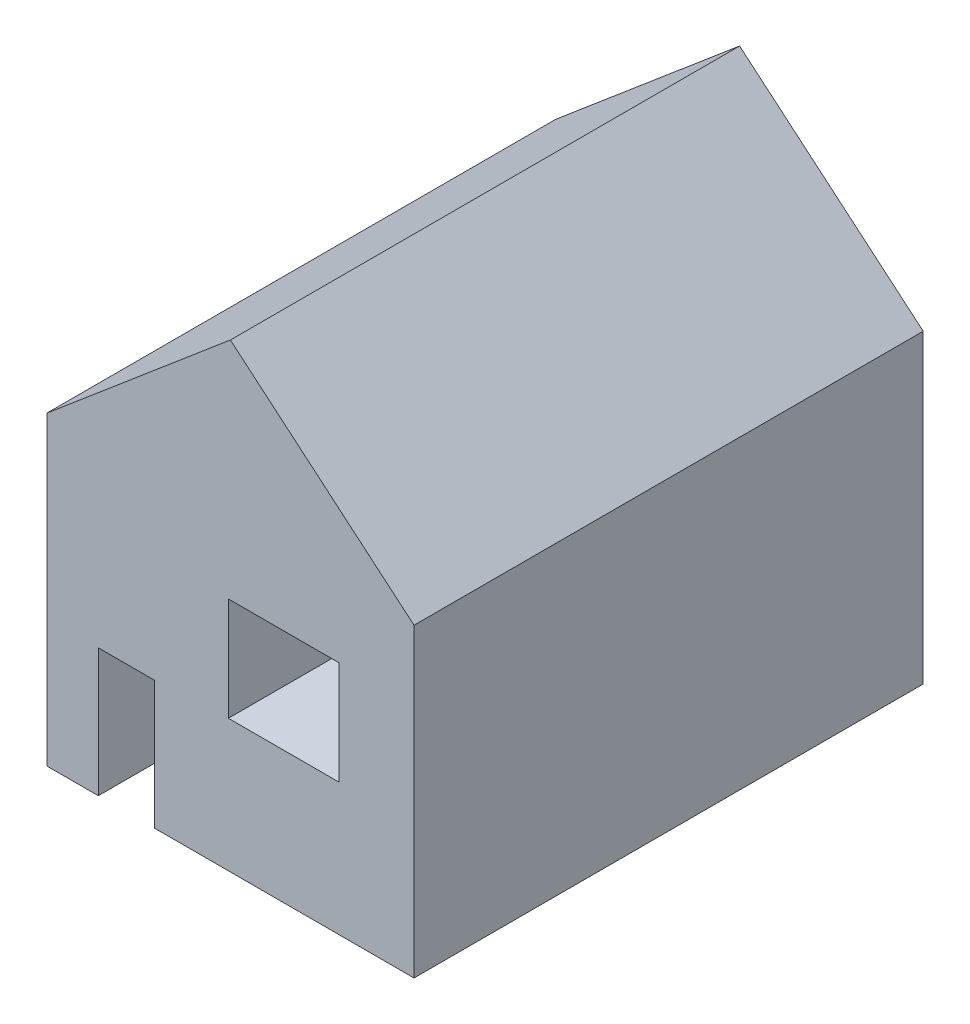
ISO-10303-21;
HEADER;
FILE_DESCRIPTION(('STEP AP214'),'2;1');
FILE_NAME('part.step','',(''),(''),'','','');
FILE_SCHEMA(('AUTOMOTIVE_DESIGN { 1 0 10303 214 1 1 1 1 }'));
ENDSEC;
DATA;
#1=APPLICATION_CONTEXT('core data for automotive mechanical design processes');
#2=APPLICATION_PROTOCOL_DEFINITION('international standard','automotive_design',2000,#1);
#3=PRODUCT_CONTEXT('',#1,'mechanical');
#4=PRODUCT('Part','Part','',(#3));
#5=PRODUCT_RELATED_PRODUCT_CATEGORY('part','',(#4));
#6=PRODUCT_DEFINITION_FORMATION('','',#4);
#7=PRODUCT_DEFINITION_CONTEXT('part definition',#1,'design');
#8=PRODUCT_DEFINITION('design','',#6,#7);
#9=PRODUCT_DEFINITION_SHAPE('','',#8);
#10=(LENGTH_UNIT() NAMED_UNIT(*) SI_UNIT(.MILLI.,.METRE.));
#11=(NAMED_UNIT(*) PLANE_ANGLE_UNIT() SI_UNIT($,.RADIAN.));
#12=(NAMED_UNIT(*) SI_UNIT($,.STERADIAN.) SOLID_ANGLE_UNIT());
#13=UNCERTAINTY_MEASURE_WITH_UNIT(LENGTH_MEASURE(1.E-05),#10,'distance_accuracy_value','');
#14=(GEOMETRIC_REPRESENTATION_CONTEXT(3) GLOBAL_UNCERTAINTY_ASSIGNED_CONTEXT((#13)) GLOBAL_UNIT_ASSIGNED_CONTEXT((#10,
#11,#12)) REPRESENTATION_CONTEXT('',''));
#15=CARTESIAN_POINT('',(0.,0.,0.));
#16=DIRECTION('',(0.,0.,1.));
#17=DIRECTION('',(1.,0.,0.));
#18=AXIS2_PLACEMENT_3D('',#15,#16,#17);
#19=CARTESIAN_POINT('',(0.,-3.62960003633556,-80.));
#20=DIRECTION('',(0.,-1.,0.));
#21=DIRECTION('',(0.,0.,-1.));
#22=AXIS2_PLACEMENT_3D('',#19,#20,#21);
#23=PLANE('',#22);
#24=DIRECTION('',(1.,0.,0.));
#25=VECTOR('',#24,1.);
#26=CARTESIAN_POINT('',(0.,-3.62960003633556,0.));
#27=LINE('',#26,#25);
#28=CARTESIAN_POINT('',(-74.7897581738786,-3.62960003633556,0.));
#29=VERTEX_POINT('',#28);
#30=CARTESIAN_POINT('',(-65.9867486639112,-3.62960003633556,0.));
#31=VERTEX_POINT('',#30);
#32=EDGE_CURVE('E169',#29,#31,#27,.T.);
#33=ORIENTED_EDGE('',*,*,#32,.F.);
#34=DIRECTION('',(0.,0.,1.));
#35=VECTOR('',#34,1.);
#36=CARTESIAN_POINT('',(-74.7897581738786,-3.62960003633556,-80.));
#37=LINE('',#36,#35);
#38=CARTESIAN_POINT('',(-74.7897581738786,-3.62960003633556,-80.));
#39=VERTEX_POINT('',#38);
#40=EDGE_CURVE('E11',#39,#29,#37,.T.);
#41=ORIENTED_EDGE('',*,*,#40,.F.);
#42=DIRECTION('',(1.,0.,0.));
#43=VECTOR('',#42,1.);
#44=CARTESIAN_POINT('',(0.,-3.62960003633556,-80.));
#45=LINE('',#44,#43);
#46=CARTESIAN_POINT('',(-65.9867486639112,-3.62960003633556,-80.));
#47=VERTEX_POINT('',#46);
#48=EDGE_CURVE('E222',#39,#47,#45,.T.);
#49=ORIENTED_EDGE('',*,*,#48,.T.);
#50=DIRECTION('',(0.,0.,1.));
#51=VECTOR('',#50,1.);
#52=CARTESIAN_POINT('',(-65.9867486639112,-3.62960003633556,-80.));
#53=LINE('',#52,#51);
#54=EDGE_CURVE('E196',#47,#31,#53,.T.);
#55=ORIENTED_EDGE('',*,*,#54,.T.);
#56=EDGE_LOOP('',(#33,#41,#49,#55));
#57=FACE_BOUND('',#56,.T.);
#58=ADVANCED_FACE('F35',(#57),#23,.T.);
#59=CARTESIAN_POINT('',(-74.7897581738786,0.,-80.));
#60=DIRECTION('',(1.,0.,0.));
#61=DIRECTION('',(0.,0.,-1.));
#62=AXIS2_PLACEMENT_3D('',#59,#60,#61);
#63=PLANE('',#62);
#64=DIRECTION('',(0.,1.,0.));
#65=VECTOR('',#64,1.);
#66=CARTESIAN_POINT('',(-74.7897581738786,0.,0.));
#67=LINE('',#66,#65);
#68=CARTESIAN_POINT('',(-74.7897581738786,-23.7561001419538,0.));
#69=VERTEX_POINT('',#68);
#70=EDGE_CURVE('E183',#69,#29,#67,.T.);
#71=ORIENTED_EDGE('',*,*,#70,.F.);
#72=DIRECTION('',(0.,0.,1.));
#73=VECTOR('',#72,1.);
#74=CARTESIAN_POINT('',(-74.7897581738786,-23.7561001419538,-80.));
#75=LINE('',#74,#73);
#76=CARTESIAN_POINT('',(-74.7897581738786,-23.7561001419538,-80.));
#77=VERTEX_POINT('',#76);
#78=EDGE_CURVE('E45',#77,#69,#75,.T.);
#79=ORIENTED_EDGE('',*,*,#78,.F.);
#80=DIRECTION('',(0.,1.,0.));
#81=VECTOR('',#80,1.);
#82=CARTESIAN_POINT('',(-74.7897581738786,0.,-80.));
#83=LINE('',#82,#81);
#84=EDGE_CURVE('E149',#77,#39,#83,.T.);
#85=ORIENTED_EDGE('',*,*,#84,.T.);
#86=ORIENTED_EDGE('',*,*,#40,.T.);
#87=EDGE_LOOP('',(#71,#79,#85,#86));
#88=FACE_BOUND('',#87,.T.);
#89=ADVANCED_FACE('F245',(#88),#63,.T.);
#90=CARTESIAN_POINT('',(0.,-23.7561001419538,-80.));
#91=DIRECTION('',(0.,-1.,0.));
#92=DIRECTION('',(0.,0.,-1.));
#93=AXIS2_PLACEMENT_3D('',#90,#91,#92);
#94=PLANE('',#93);
#95=DIRECTION('',(1.,0.,0.));
#96=VECTOR('',#95,1.);
#97=CARTESIAN_POINT('',(0.,-23.7561001419538,0.));
#98=LINE('',#97,#96);
#99=CARTESIAN_POINT('',(-82.8897581738786,-23.7561001419538,0.));
#100=VERTEX_POINT('',#99);
#101=EDGE_CURVE('E136',#100,#69,#98,.T.);
#102=ORIENTED_EDGE('',*,*,#101,.F.);
#103=DIRECTION('',(0.,0.,1.));
#104=VECTOR('',#103,1.);
#105=CARTESIAN_POINT('',(-82.8897581738786,-23.7561001419538,-80.));
#106=LINE('',#105,#104);
#107=CARTESIAN_POINT('',(-82.8897581738786,-23.7561001419538,-80.));
#108=VERTEX_POINT('',#107);
#109=EDGE_CURVE('E131',#108,#100,#106,.T.);
#110=ORIENTED_EDGE('',*,*,#109,.F.);
#111=DIRECTION('',(1.,0.,0.));
#112=VECTOR('',#111,1.);
#113=CARTESIAN_POINT('',(0.,-23.7561001419538,-80.));
#114=LINE('',#113,#112);
#115=EDGE_CURVE('E134',#108,#77,#114,.T.);
#116=ORIENTED_EDGE('',*,*,#115,.T.);
#117=ORIENTED_EDGE('',*,*,#78,.T.);
#118=EDGE_LOOP('',(#102,#110,#116,#117));
#119=FACE_BOUND('',#118,.T.);
#120=ADVANCED_FACE('F133',(#119),#94,.T.);
#121=CARTESIAN_POINT('',(-82.8897581738786,0.,-80.));
#122=DIRECTION('',(-1.,0.,0.));
#123=DIRECTION('',(0.,0.,1.));
#124=AXIS2_PLACEMENT_3D('',#121,#122,#123);
#125=PLANE('',#124);
#126=DIRECTION('',(0.,-1.,0.));
#127=VECTOR('',#126,1.);
#128=CARTESIAN_POINT('',(-82.8897581738786,0.,0.));
#129=LINE('',#128,#127);
#130=CARTESIAN_POINT('',(-82.8897581738786,24.2438998580462,0.));
#131=VERTEX_POINT('',#130);
#132=EDGE_CURVE('E181',#131,#100,#129,.T.);
#133=ORIENTED_EDGE('',*,*,#132,.F.);
#134=DIRECTION('',(0.,0.,1.));
#135=VECTOR('',#134,1.);
#136=CARTESIAN_POINT('',(-82.8897581738786,24.2438998580462,-80.));
#137=LINE('',#136,#135);
#138=CARTESIAN_POINT('',(-82.8897581738786,24.2438998580462,-80.));
#139=VERTEX_POINT('',#138);
#140=EDGE_CURVE('E141',#139,#131,#137,.T.);
#141=ORIENTED_EDGE('',*,*,#140,.F.);
#142=DIRECTION('',(0.,-1.,0.));
#143=VECTOR('',#142,1.);
#144=CARTESIAN_POINT('',(-82.8897581738786,0.,-80.));
#145=LINE('',#144,#143);
#146=EDGE_CURVE('E147',#139,#108,#145,.T.);
#147=ORIENTED_EDGE('',*,*,#146,.T.);
#148=ORIENTED_EDGE('',*,*,#109,.T.);
#149=EDGE_LOOP('',(#133,#141,#147,#148));
#150=FACE_BOUND('',#149,.T.);
#151=ADVANCED_FACE('F152',(#150),#125,.T.);
#152=CARTESIAN_POINT('',(-25.1919853273553,0.,-80.));
#153=DIRECTION('',(-1.,0.,0.));
#154=DIRECTION('',(0.,-1.,0.));
#155=AXIS2_PLACEMENT_3D('',#152,#153,#154);
#156=PLANE('',#155);
#157=DIRECTION('',(0.,-1.,0.));
#158=VECTOR('',#157,1.);
#159=CARTESIAN_POINT('',(-25.1919853273553,0.,0.));
#160=LINE('',#159,#158);
#161=CARTESIAN_POINT('',(-25.1919853273553,24.2438998580462,0.));
#162=VERTEX_POINT('',#161);
#163=CARTESIAN_POINT('',(-25.1919853273552,-23.7561001419538,0.));
#164=VERTEX_POINT('',#163);
#165=EDGE_CURVE('E178',#162,#164,#160,.T.);
#166=ORIENTED_EDGE('',*,*,#165,.T.);
#167=DIRECTION('',(0.,0.,1.));
#168=VECTOR('',#167,1.);
#169=CARTESIAN_POINT('',(-25.1919853273552,-23.7561001419538,-80.));
#170=LINE('',#169,#168);
#171=CARTESIAN_POINT('',(-25.1919853273552,-23.7561001419538,-80.));
#172=VERTEX_POINT('',#171);
#173=EDGE_CURVE('E192',#172,#164,#170,.T.);
#174=ORIENTED_EDGE('',*,*,#173,.F.);
#175=DIRECTION('',(0.,-1.,0.));
#176=VECTOR('',#175,1.);
#177=CARTESIAN_POINT('',(-25.1919853273553,0.,-80.));
#178=LINE('',#177,#176);
#179=CARTESIAN_POINT('',(-25.1919853273553,24.2438998580462,-80.));
#180=VERTEX_POINT('',#179);
#181=EDGE_CURVE('E154',#180,#172,#178,.T.);
#182=ORIENTED_EDGE('',*,*,#181,.F.);
#183=DIRECTION('',(0.,0.,1.));
#184=VECTOR('',#183,1.);
#185=CARTESIAN_POINT('',(-25.1919853273553,24.2438998580462,-80.));
#186=LINE('',#185,#184);
#187=EDGE_CURVE('E189',#180,#162,#186,.T.);
#188=ORIENTED_EDGE('',*,*,#187,.T.);
#189=EDGE_LOOP('',(#166,#174,#182,#188));
#190=FACE_BOUND('',#189,.T.);
#191=ADVANCED_FACE('F268',(#190),#156,.F.);
#192=CARTESIAN_POINT('',(-65.9867486639112,-23.7561001419538,0.));
#193=VERTEX_POINT('',#192);
#194=EDGE_CURVE('E175',#193,#164,#98,.T.);
#195=ORIENTED_EDGE('',*,*,#194,.F.);
#196=DIRECTION('',(0.,0.,1.));
#197=VECTOR('',#196,1.);
#198=CARTESIAN_POINT('',(-65.9867486639112,-23.7561001419538,-80.));
#199=LINE('',#198,#197);
#200=CARTESIAN_POINT('',(-65.9867486639112,-23.7561001419538,-80.));
#201=VERTEX_POINT('',#200);
#202=EDGE_CURVE('E194',#201,#193,#199,.T.);
#203=ORIENTED_EDGE('',*,*,#202,.F.);
#204=EDGE_CURVE('E151',#201,#172,#114,.T.);
#205=ORIENTED_EDGE('',*,*,#204,.T.);
#206=ORIENTED_EDGE('',*,*,#173,.T.);
#207=EDGE_LOOP('',(#195,#203,#205,#206));
#208=FACE_BOUND('',#207,.T.);
#209=ADVANCED_FACE('F238',(#208),#94,.T.);
#210=CARTESIAN_POINT('',(0.,-3.,-80.));
#211=DIRECTION('',(0.,-1.,0.));
#212=DIRECTION('',(0.,0.,-1.));
#213=AXIS2_PLACEMENT_3D('',#210,#211,#212);
#214=PLANE('',#213);
#215=DIRECTION('',(1.,0.,0.));
#216=VECTOR('',#215,1.);
#217=CARTESIAN_POINT('',(0.,-3.,0.));
#218=LINE('',#217,#216);
#219=CARTESIAN_POINT('',(-54.3591442802856,-3.,0.));
#220=VERTEX_POINT('',#219);
#221=CARTESIAN_POINT('',(-36.9821186485768,-3.,0.));
#222=VERTEX_POINT('',#221);
#223=EDGE_CURVE('E159',#220,#222,#218,.T.);
#224=ORIENTED_EDGE('',*,*,#223,.T.);
#225=DIRECTION('',(0.,0.,1.));
#226=VECTOR('',#225,1.);
#227=CARTESIAN_POINT('',(-36.9821186485768,-3.,-80.));
#228=LINE('',#227,#226);
#229=CARTESIAN_POINT('',(-36.9821186485768,-3.,-80.));
#230=VERTEX_POINT('',#229);
#231=EDGE_CURVE('E198',#230,#222,#228,.T.);
#232=ORIENTED_EDGE('',*,*,#231,.F.);
#233=DIRECTION('',(1.,0.,0.));
#234=VECTOR('',#233,1.);
#235=CARTESIAN_POINT('',(0.,-3.,-80.));
#236=LINE('',#235,#234);
#237=CARTESIAN_POINT('',(-54.3591442802856,-3.,-80.));
#238=VERTEX_POINT('',#237);
#239=EDGE_CURVE('E185',#238,#230,#236,.T.);
#240=ORIENTED_EDGE('',*,*,#239,.F.);
#241=DIRECTION('',(0.,0.,1.));
#242=VECTOR('',#241,1.);
#243=CARTESIAN_POINT('',(-54.3591442802856,-3.,-80.));
#244=LINE('',#243,#242);
#245=EDGE_CURVE('E39',#238,#220,#244,.T.);
#246=ORIENTED_EDGE('',*,*,#245,.T.);
#247=EDGE_LOOP('',(#224,#232,#240,#246));
#248=FACE_BOUND('',#247,.T.);
#249=ADVANCED_FACE('F37',(#248),#214,.F.);
#250=CARTESIAN_POINT('',(-36.9821186485768,0.,-80.));
#251=DIRECTION('',(1.,0.,0.));
#252=DIRECTION('',(0.,0.,-1.));
#253=AXIS2_PLACEMENT_3D('',#250,#251,#252);
#254=PLANE('',#253);
#255=DIRECTION('',(0.,1.,0.));
#256=VECTOR('',#255,1.);
#257=CARTESIAN_POINT('',(-36.9821186485768,0.,0.));
#258=LINE('',#257,#256);
#259=CARTESIAN_POINT('',(-36.9821186485768,13.2393230685379,0.));
#260=VERTEX_POINT('',#259);
#261=EDGE_CURVE('E167',#222,#260,#258,.T.);
#262=ORIENTED_EDGE('',*,*,#261,.T.);
#263=DIRECTION('',(0.,0.,1.));
#264=VECTOR('',#263,1.);
#265=CARTESIAN_POINT('',(-36.9821186485768,13.2393230685379,-80.));
#266=LINE('',#265,#264);
#267=CARTESIAN_POINT('',(-36.9821186485768,13.2393230685379,-80.));
#268=VERTEX_POINT('',#267);
#269=EDGE_CURVE('E201',#268,#260,#266,.T.);
#270=ORIENTED_EDGE('',*,*,#269,.F.);
#271=DIRECTION('',(0.,1.,0.));
#272=VECTOR('',#271,1.);
#273=CARTESIAN_POINT('',(-36.9821186485768,0.,-80.));
#274=LINE('',#273,#272);
#275=EDGE_CURVE('E220',#230,#268,#274,.T.);
#276=ORIENTED_EDGE('',*,*,#275,.F.);
#277=ORIENTED_EDGE('',*,*,#231,.T.);
#278=EDGE_LOOP('',(#262,#270,#276,#277));
#279=FACE_BOUND('',#278,.T.);
#280=ADVANCED_FACE('F219',(#279),#254,.F.);
#281=CARTESIAN_POINT('',(0.,13.2393230685379,-80.));
#282=DIRECTION('',(0.,1.,0.));
#283=DIRECTION('',(0.,0.,1.));
#284=AXIS2_PLACEMENT_3D('',#281,#282,#283);
#285=PLANE('',#284);
#286=DIRECTION('',(-1.,0.,0.));
#287=VECTOR('',#286,1.);
#288=CARTESIAN_POINT('',(0.,13.2393230685379,0.));
#289=LINE('',#288,#287);
#290=CARTESIAN_POINT('',(-54.3591442802856,13.2393230685379,0.));
#291=VERTEX_POINT('',#290);
#292=EDGE_CURVE('E165',#260,#291,#289,.T.);
#293=ORIENTED_EDGE('',*,*,#292,.T.);
#294=DIRECTION('',(0.,0.,1.));
#295=VECTOR('',#294,1.);
#296=CARTESIAN_POINT('',(-54.3591442802856,13.2393230685379,-80.));
#297=LINE('',#296,#295);
#298=CARTESIAN_POINT('',(-54.3591442802856,13.2393230685379,-80.));
#299=VERTEX_POINT('',#298);
#300=EDGE_CURVE('E203',#299,#291,#297,.T.);
#301=ORIENTED_EDGE('',*,*,#300,.F.);
#302=DIRECTION('',(-1.,0.,0.));
#303=VECTOR('',#302,1.);
#304=CARTESIAN_POINT('',(0.,13.2393230685379,-80.));
#305=LINE('',#304,#303);
#306=EDGE_CURVE('E223',#268,#299,#305,.T.);
#307=ORIENTED_EDGE('',*,*,#306,.F.);
#308=ORIENTED_EDGE('',*,*,#269,.T.);
#309=EDGE_LOOP('',(#293,#301,#307,#308));
#310=FACE_BOUND('',#309,.T.);
#311=ADVANCED_FACE('F287',(#310),#285,.F.);
#312=CARTESIAN_POINT('',(-54.3591442802856,0.,-80.));
#313=DIRECTION('',(-1.,0.,0.));
#314=DIRECTION('',(0.,0.,1.));
#315=AXIS2_PLACEMENT_3D('',#312,#313,#314);
#316=PLANE('',#315);
#317=DIRECTION('',(0.,-1.,0.));
#318=VECTOR('',#317,1.);
#319=CARTESIAN_POINT('',(-54.3591442802856,0.,0.));
#320=LINE('',#319,#318);
#321=EDGE_CURVE('E162',#291,#220,#320,.T.);
#322=ORIENTED_EDGE('',*,*,#321,.T.);
#323=ORIENTED_EDGE('',*,*,#245,.F.);
#324=DIRECTION('',(0.,-1.,0.));
#325=VECTOR('',#324,1.);
#326=CARTESIAN_POINT('',(-54.3591442802856,0.,-80.));
#327=LINE('',#326,#325);
#328=EDGE_CURVE('E103',#299,#238,#327,.T.);
#329=ORIENTED_EDGE('',*,*,#328,.F.);
#330=ORIENTED_EDGE('',*,*,#300,.T.);
#331=EDGE_LOOP('',(#322,#323,#329,#330));
#332=FACE_BOUND('',#331,.T.);
#333=ADVANCED_FACE('F289',(#332),#316,.F.);
#334=CARTESIAN_POINT('',(-65.9867486639112,0.,-80.));
#335=DIRECTION('',(-1.,0.,0.));
#336=DIRECTION('',(0.,0.,1.));
#337=AXIS2_PLACEMENT_3D('',#334,#335,#336);
#338=PLANE('',#337);
#339=DIRECTION('',(0.,-1.,0.));
#340=VECTOR('',#339,1.);
#341=CARTESIAN_POINT('',(-65.9867486639112,0.,0.));
#342=LINE('',#341,#340);
#343=EDGE_CURVE('E172',#31,#193,#342,.T.);
#344=ORIENTED_EDGE('',*,*,#343,.F.);
#345=ORIENTED_EDGE('',*,*,#54,.F.);
#346=DIRECTION('',(0.,-1.,0.));
#347=VECTOR('',#346,1.);
#348=CARTESIAN_POINT('',(-65.9867486639112,0.,-80.));
#349=LINE('',#348,#347);
#350=EDGE_CURVE('E232',#47,#201,#349,.T.);
#351=ORIENTED_EDGE('',*,*,#350,.T.);
#352=ORIENTED_EDGE('',*,*,#202,.T.);
#353=EDGE_LOOP('',(#344,#345,#351,#352));
#354=FACE_BOUND('',#353,.T.);
#355=ADVANCED_FACE('F244',(#354),#338,.T.);
#356=CARTESIAN_POINT('',(0.,0.,-80.));
#357=DIRECTION('',(0.,0.,1.));
#358=DIRECTION('',(1.,0.,0.));
#359=AXIS2_PLACEMENT_3D('',#356,#357,#358);
#360=PLANE('',#359);
#361=ORIENTED_EDGE('',*,*,#239,.T.);
#362=ORIENTED_EDGE('',*,*,#275,.T.);
#363=ORIENTED_EDGE('',*,*,#306,.T.);
#364=ORIENTED_EDGE('',*,*,#328,.T.);
#365=EDGE_LOOP('',(#361,#362,#363,#364));
#366=FACE_BOUND('',#365,.T.);
#367=ORIENTED_EDGE('',*,*,#48,.F.);
#368=ORIENTED_EDGE('',*,*,#84,.F.);
#369=ORIENTED_EDGE('',*,*,#115,.F.);
#370=ORIENTED_EDGE('',*,*,#146,.F.);
#371=DIRECTION('',(0.763794182395355,0.645459872446779,0.));
#372=VECTOR('',#371,1.);
#373=CARTESIAN_POINT('',(-46.4856084736998,55.0079700272114,-80.));
#374=LINE('',#373,#372);
#375=CARTESIAN_POINT('',(-54.0408717506169,48.6232404974223,-80.));
#376=VERTEX_POINT('',#375);
#377=EDGE_CURVE('E255',#139,#376,#374,.T.);
#378=ORIENTED_EDGE('',*,*,#377,.T.);
#379=DIRECTION('',(0.763794182395355,-0.645459872446779,0.));
#380=VECTOR('',#379,1.);
#381=CARTESIAN_POINT('',(1.45676035375511,1.72383308527688,-80.));
#382=LINE('',#381,#380);
#383=EDGE_CURVE('E257',#376,#180,#382,.T.);
#384=ORIENTED_EDGE('',*,*,#383,.T.);
#385=ORIENTED_EDGE('',*,*,#181,.T.);
#386=ORIENTED_EDGE('',*,*,#204,.F.);
#387=ORIENTED_EDGE('',*,*,#350,.F.);
#388=EDGE_LOOP('',(#367,#368,#369,#370,#378,#384,#385,#386,#387));
#389=FACE_BOUND('',#388,.T.);
#390=ADVANCED_FACE('F145',(#366,#389),#360,.F.);
#391=CARTESIAN_POINT('',(0.,0.,0.));
#392=DIRECTION('',(0.,0.,1.));
#393=DIRECTION('',(1.,0.,0.));
#394=AXIS2_PLACEMENT_3D('',#391,#392,#393);
#395=PLANE('',#394);
#396=ORIENTED_EDGE('',*,*,#223,.F.);
#397=ORIENTED_EDGE('',*,*,#321,.F.);
#398=ORIENTED_EDGE('',*,*,#292,.F.);
#399=ORIENTED_EDGE('',*,*,#261,.F.);
#400=EDGE_LOOP('',(#396,#397,#398,#399));
#401=FACE_BOUND('',#400,.T.);
#402=ORIENTED_EDGE('',*,*,#32,.T.);
#403=ORIENTED_EDGE('',*,*,#343,.T.);
#404=ORIENTED_EDGE('',*,*,#194,.T.);
#405=ORIENTED_EDGE('',*,*,#165,.F.);
#406=DIRECTION('',(0.763794182395355,-0.645459872446779,0.));
#407=VECTOR('',#406,1.);
#408=CARTESIAN_POINT('',(1.45676035375511,1.72383308527688,0.));
#409=LINE('',#408,#407);
#410=CARTESIAN_POINT('',(-54.0408717506169,48.6232404974223,0.));
#411=VERTEX_POINT('',#410);
#412=EDGE_CURVE('E261',#411,#162,#409,.T.);
#413=ORIENTED_EDGE('',*,*,#412,.F.);
#414=DIRECTION('',(0.763794182395355,0.645459872446779,0.));
#415=VECTOR('',#414,1.);
#416=CARTESIAN_POINT('',(-46.4856084736998,55.0079700272114,0.));
#417=LINE('',#416,#415);
#418=EDGE_CURVE('E249',#131,#411,#417,.T.);
#419=ORIENTED_EDGE('',*,*,#418,.F.);
#420=ORIENTED_EDGE('',*,*,#132,.T.);
#421=ORIENTED_EDGE('',*,*,#101,.T.);
#422=ORIENTED_EDGE('',*,*,#70,.T.);
#423=EDGE_LOOP('',(#402,#403,#404,#405,#413,#419,#420,#421,#422));
#424=FACE_BOUND('',#423,.T.);
#425=ADVANCED_FACE('F214',(#401,#424),#395,.T.);
#426=CARTESIAN_POINT('',(1.45676035375511,1.72383308527688,-80.));
#427=DIRECTION('',(-0.645459872446779,-0.763794182395355,0.));
#428=DIRECTION('',(0.763794182395355,-0.645459872446779,0.));
#429=AXIS2_PLACEMENT_3D('',#426,#427,#428);
#430=PLANE('',#429);
#431=ORIENTED_EDGE('',*,*,#412,.T.);
#432=ORIENTED_EDGE('',*,*,#187,.F.);
#433=ORIENTED_EDGE('',*,*,#383,.F.);
#434=DIRECTION('',(0.,0.,1.));
#435=VECTOR('',#434,1.);
#436=CARTESIAN_POINT('',(-54.0408717506169,48.6232404974223,-80.));
#437=LINE('',#436,#435);
#438=EDGE_CURVE('E163',#376,#411,#437,.T.);
#439=ORIENTED_EDGE('',*,*,#438,.T.);
#440=EDGE_LOOP('',(#431,#432,#433,#439));
#441=FACE_BOUND('',#440,.T.);
#442=ADVANCED_FACE('F265',(#441),#430,.F.);
#443=CARTESIAN_POINT('',(-46.4856084736998,55.0079700272114,-80.));
#444=DIRECTION('',(0.645459872446779,-0.763794182395355,0.));
#445=DIRECTION('',(0.763794182395355,0.645459872446779,0.));
#446=AXIS2_PLACEMENT_3D('',#443,#444,#445);
#447=PLANE('',#446);
#448=ORIENTED_EDGE('',*,*,#418,.T.);
#449=ORIENTED_EDGE('',*,*,#438,.F.);
#450=ORIENTED_EDGE('',*,*,#377,.F.);
#451=ORIENTED_EDGE('',*,*,#140,.T.);
#452=EDGE_LOOP('',(#448,#449,#450,#451));
#453=FACE_BOUND('',#452,.T.);
#454=ADVANCED_FACE('F252',(#453),#447,.F.);
#455=CLOSED_SHELL('',(#58,#89,#120,#151,#191,#209,#249,#280,#311,#333,#355,#390,#425,#442,#454));
#456=MANIFOLD_SOLID_BREP('B2',#455);
#457=ADVANCED_BREP_SHAPE_REPRESENTATION('',(#18,#456),#14);
#458=SHAPE_DEFINITION_REPRESENTATION(#9,#457);
ENDSEC;
END-ISO-10303-21;
